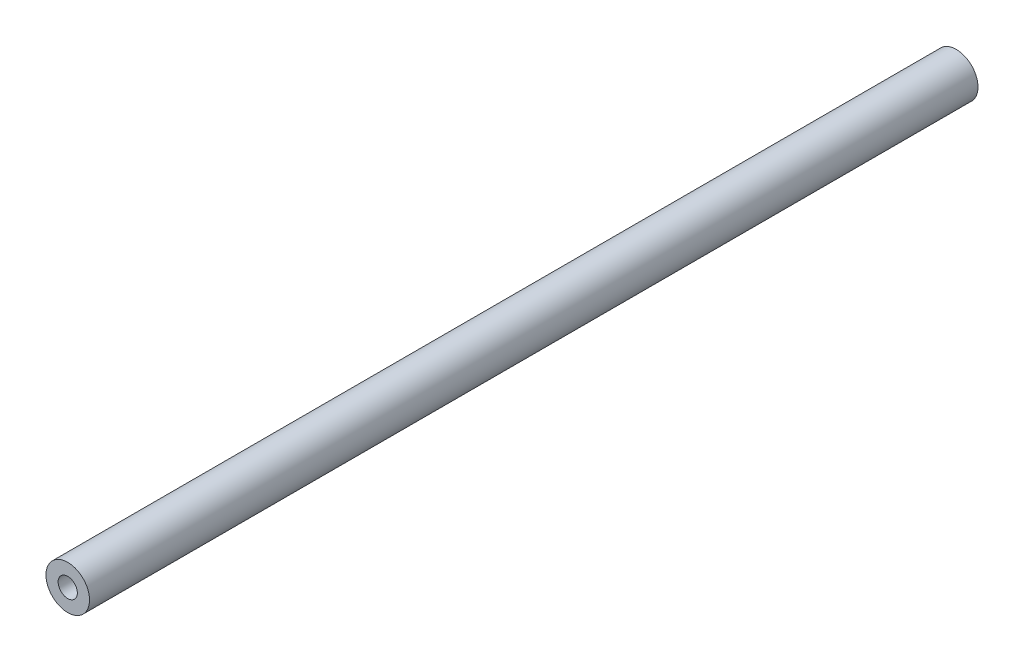
ISO-10303-21;
HEADER;
FILE_DESCRIPTION(('STEP AP214'),'2;1');
FILE_NAME('part.step','',(''),(''),'','','');
FILE_SCHEMA(('AUTOMOTIVE_DESIGN { 1 0 10303 214 1 1 1 1 }'));
ENDSEC;
DATA;
#1=APPLICATION_CONTEXT('core data for automotive mechanical design processes');
#2=APPLICATION_PROTOCOL_DEFINITION('international standard','automotive_design',2000,#1);
#3=PRODUCT_CONTEXT('',#1,'mechanical');
#4=PRODUCT('Part','Part','',(#3));
#5=PRODUCT_RELATED_PRODUCT_CATEGORY('part','',(#4));
#6=PRODUCT_DEFINITION_FORMATION('','',#4);
#7=PRODUCT_DEFINITION_CONTEXT('part definition',#1,'design');
#8=PRODUCT_DEFINITION('design','',#6,#7);
#9=PRODUCT_DEFINITION_SHAPE('','',#8);
#10=(LENGTH_UNIT() NAMED_UNIT(*) SI_UNIT(.MILLI.,.METRE.));
#11=(NAMED_UNIT(*) PLANE_ANGLE_UNIT() SI_UNIT($,.RADIAN.));
#12=(NAMED_UNIT(*) SI_UNIT($,.STERADIAN.) SOLID_ANGLE_UNIT());
#13=UNCERTAINTY_MEASURE_WITH_UNIT(LENGTH_MEASURE(1.E-05),#10,'distance_accuracy_value','');
#14=(GEOMETRIC_REPRESENTATION_CONTEXT(3) GLOBAL_UNCERTAINTY_ASSIGNED_CONTEXT((#13)) GLOBAL_UNIT_ASSIGNED_CONTEXT((#10,
#11,#12)) REPRESENTATION_CONTEXT('',''));
#15=CARTESIAN_POINT('',(0.,0.,0.));
#16=DIRECTION('',(0.,0.,1.));
#17=DIRECTION('',(1.,0.,0.));
#18=AXIS2_PLACEMENT_3D('',#15,#16,#17);
#19=CARTESIAN_POINT('',(0.,0.,80.9625));
#20=DIRECTION('',(0.,0.,-1.));
#21=DIRECTION('',(-1.,0.,0.));
#22=AXIS2_PLACEMENT_3D('',#19,#20,#21);
#23=CYLINDRICAL_SURFACE('',#22,3.96875);
#24=CARTESIAN_POINT('',(0.,0.,80.9625));
#25=DIRECTION('',(0.,0.,1.));
#26=DIRECTION('',(1.,0.,0.));
#27=AXIS2_PLACEMENT_3D('',#24,#25,#26);
#28=CIRCLE('',#27,3.96875);
#29=CARTESIAN_POINT('',(3.96875,0.,80.9625));
#30=VERTEX_POINT('',#29);
#31=EDGE_CURVE('E11',#30,#30,#28,.T.);
#32=ORIENTED_EDGE('',*,*,#31,.F.);
#33=EDGE_LOOP('',(#32));
#34=FACE_BOUND('',#33,.T.);
#35=CARTESIAN_POINT('',(0.,0.,-80.9625));
#36=DIRECTION('',(0.,0.,1.));
#37=DIRECTION('',(1.,0.,0.));
#38=AXIS2_PLACEMENT_3D('',#35,#36,#37);
#39=CIRCLE('',#38,3.96875);
#40=CARTESIAN_POINT('',(3.96875,0.,-80.9625));
#41=VERTEX_POINT('',#40);
#42=EDGE_CURVE('E37',#41,#41,#39,.T.);
#43=ORIENTED_EDGE('',*,*,#42,.T.);
#44=EDGE_LOOP('',(#43));
#45=FACE_BOUND('',#44,.T.);
#46=ADVANCED_FACE('F34',(#34,#45),#23,.T.);
#47=CARTESIAN_POINT('',(0.,0.,80.9625));
#48=DIRECTION('',(0.,0.,1.));
#49=DIRECTION('',(1.,0.,0.));
#50=AXIS2_PLACEMENT_3D('',#47,#48,#49);
#51=PLANE('',#50);
#52=CARTESIAN_POINT('',(0.,0.,80.9625));
#53=DIRECTION('',(0.,0.,1.));
#54=DIRECTION('',(1.,0.,0.));
#55=AXIS2_PLACEMENT_3D('',#52,#53,#54);
#56=CIRCLE('',#55,1.7526);
#57=CARTESIAN_POINT('',(1.7526,0.,80.9625));
#58=VERTEX_POINT('',#57);
#59=EDGE_CURVE('E191',#58,#58,#56,.T.);
#60=ORIENTED_EDGE('',*,*,#59,.F.);
#61=EDGE_LOOP('',(#60));
#62=FACE_BOUND('',#61,.T.);
#63=ORIENTED_EDGE('',*,*,#31,.T.);
#64=EDGE_LOOP('',(#63));
#65=FACE_BOUND('',#64,.T.);
#66=ADVANCED_FACE('F84',(#62,#65),#51,.T.);
#67=CARTESIAN_POINT('',(0.,0.,-80.9625));
#68=DIRECTION('',(0.,0.,1.));
#69=DIRECTION('',(1.,0.,0.));
#70=AXIS2_PLACEMENT_3D('',#67,#68,#69);
#71=PLANE('',#70);
#72=CARTESIAN_POINT('',(0.,0.,-80.9625));
#73=DIRECTION('',(0.,0.,-1.));
#74=DIRECTION('',(-1.,0.,0.));
#75=AXIS2_PLACEMENT_3D('',#72,#73,#74);
#76=CIRCLE('',#75,1.7526);
#77=CARTESIAN_POINT('',(-1.7526,0.,-80.9625));
#78=VERTEX_POINT('',#77);
#79=EDGE_CURVE('E57',#78,#78,#76,.T.);
#80=ORIENTED_EDGE('',*,*,#79,.F.);
#81=EDGE_LOOP('',(#80));
#82=FACE_BOUND('',#81,.T.);
#83=ORIENTED_EDGE('',*,*,#42,.F.);
#84=EDGE_LOOP('',(#83));
#85=FACE_BOUND('',#84,.T.);
#86=ADVANCED_FACE('F81',(#82,#85),#71,.F.);
#87=CARTESIAN_POINT('',(0.,0.,-71.5645));
#88=DIRECTION('',(0.,0.,-1.));
#89=DIRECTION('',(-1.,0.,0.));
#90=AXIS2_PLACEMENT_3D('',#87,#88,#89);
#91=CONICAL_SURFACE('',#90,1.35255,1.02974425867665);
#92=CARTESIAN_POINT('',(0.,0.,-70.7518059697343));
#93=VERTEX_POINT('',#92);
#94=VERTEX_LOOP('',#93);
#95=FACE_BOUND('',#94,.T.);
#96=CARTESIAN_POINT('',(0.,0.,-71.5645));
#97=DIRECTION('',(0.,0.,-1.));
#98=DIRECTION('',(-1.,0.,0.));
#99=AXIS2_PLACEMENT_3D('',#96,#97,#98);
#100=CIRCLE('',#99,1.35255);
#101=CARTESIAN_POINT('',(-1.35255,0.,-71.5645));
#102=VERTEX_POINT('',#101);
#103=EDGE_CURVE('E73',#102,#102,#100,.T.);
#104=ORIENTED_EDGE('',*,*,#103,.T.);
#105=EDGE_LOOP('',(#104));
#106=FACE_BOUND('',#105,.T.);
#107=ADVANCED_FACE('F83',(#95,#106),#91,.F.);
#108=CARTESIAN_POINT('',(0.,0.,-80.9625));
#109=DIRECTION('',(0.,0.,-1.));
#110=DIRECTION('',(-1.,0.,0.));
#111=AXIS2_PLACEMENT_3D('',#108,#109,#110);
#112=CYLINDRICAL_SURFACE('',#111,1.35255);
#113=ORIENTED_EDGE('',*,*,#103,.F.);
#114=EDGE_LOOP('',(#113));
#115=FACE_BOUND('',#114,.T.);
#116=CARTESIAN_POINT('',(0.,0.,-73.8505));
#117=DIRECTION('',(0.,0.,-1.));
#118=DIRECTION('',(-1.,0.,0.));
#119=AXIS2_PLACEMENT_3D('',#116,#117,#118);
#120=CIRCLE('',#119,1.35255);
#121=CARTESIAN_POINT('',(-1.35255,0.,-73.8505));
#122=VERTEX_POINT('',#121);
#123=EDGE_CURVE('E70',#122,#122,#120,.T.);
#124=ORIENTED_EDGE('',*,*,#123,.T.);
#125=EDGE_LOOP('',(#124));
#126=FACE_BOUND('',#125,.T.);
#127=ADVANCED_FACE('F90',(#115,#126),#112,.F.);
#128=CARTESIAN_POINT('',(1.35255,0.,-73.8505));
#129=DIRECTION('',(0.,0.,1.));
#130=DIRECTION('',(1.,0.,0.));
#131=AXIS2_PLACEMENT_3D('',#128,#129,#130);
#132=PLANE('',#131);
#133=ORIENTED_EDGE('',*,*,#123,.F.);
#134=EDGE_LOOP('',(#133));
#135=FACE_BOUND('',#134,.T.);
#136=CARTESIAN_POINT('',(0.,0.,-73.8505));
#137=DIRECTION('',(0.,0.,-1.));
#138=DIRECTION('',(-1.,0.,0.));
#139=AXIS2_PLACEMENT_3D('',#136,#137,#138);
#140=CIRCLE('',#139,1.7526);
#141=CARTESIAN_POINT('',(-1.7526,0.,-73.8505));
#142=VERTEX_POINT('',#141);
#143=EDGE_CURVE('E61',#142,#142,#140,.T.);
#144=ORIENTED_EDGE('',*,*,#143,.T.);
#145=EDGE_LOOP('',(#144));
#146=FACE_BOUND('',#145,.T.);
#147=ADVANCED_FACE('F153',(#135,#146),#132,.F.);
#148=CARTESIAN_POINT('',(0.,0.,-80.9625));
#149=DIRECTION('',(0.,0.,-1.));
#150=DIRECTION('',(-1.,0.,0.));
#151=AXIS2_PLACEMENT_3D('',#148,#149,#150);
#152=CYLINDRICAL_SURFACE('',#151,1.7526);
#153=ORIENTED_EDGE('',*,*,#143,.F.);
#154=EDGE_LOOP('',(#153));
#155=FACE_BOUND('',#154,.T.);
#156=ORIENTED_EDGE('',*,*,#79,.T.);
#157=EDGE_LOOP('',(#156));
#158=FACE_BOUND('',#157,.T.);
#159=ADVANCED_FACE('F51',(#155,#158),#152,.F.);
#160=CARTESIAN_POINT('',(0.,0.,71.5645));
#161=DIRECTION('',(0.,0.,1.));
#162=DIRECTION('',(1.,0.,0.));
#163=AXIS2_PLACEMENT_3D('',#160,#161,#162);
#164=CONICAL_SURFACE('',#163,1.35255,1.02974425867665);
#165=CARTESIAN_POINT('',(0.,0.,70.7518059697343));
#166=VERTEX_POINT('',#165);
#167=VERTEX_LOOP('',#166);
#168=FACE_BOUND('',#167,.T.);
#169=CARTESIAN_POINT('',(0.,0.,71.5645));
#170=DIRECTION('',(0.,0.,1.));
#171=DIRECTION('',(1.,0.,0.));
#172=AXIS2_PLACEMENT_3D('',#169,#170,#171);
#173=CIRCLE('',#172,1.35255);
#174=CARTESIAN_POINT('',(1.35255,0.,71.5645));
#175=VERTEX_POINT('',#174);
#176=EDGE_CURVE('E55',#175,#175,#173,.T.);
#177=ORIENTED_EDGE('',*,*,#176,.T.);
#178=EDGE_LOOP('',(#177));
#179=FACE_BOUND('',#178,.T.);
#180=ADVANCED_FACE('F47',(#168,#179),#164,.F.);
#181=CARTESIAN_POINT('',(0.,0.,80.9625));
#182=DIRECTION('',(0.,0.,1.));
#183=DIRECTION('',(1.,0.,0.));
#184=AXIS2_PLACEMENT_3D('',#181,#182,#183);
#185=CYLINDRICAL_SURFACE('',#184,1.35255);
#186=ORIENTED_EDGE('',*,*,#176,.F.);
#187=EDGE_LOOP('',(#186));
#188=FACE_BOUND('',#187,.T.);
#189=CARTESIAN_POINT('',(0.,0.,73.8505));
#190=DIRECTION('',(0.,0.,1.));
#191=DIRECTION('',(1.,0.,0.));
#192=AXIS2_PLACEMENT_3D('',#189,#190,#191);
#193=CIRCLE('',#192,1.35255);
#194=CARTESIAN_POINT('',(1.35255,0.,73.8505));
#195=VERTEX_POINT('',#194);
#196=EDGE_CURVE('E58',#195,#195,#193,.T.);
#197=ORIENTED_EDGE('',*,*,#196,.T.);
#198=EDGE_LOOP('',(#197));
#199=FACE_BOUND('',#198,.T.);
#200=ADVANCED_FACE('F50',(#188,#199),#185,.F.);
#201=CARTESIAN_POINT('',(1.35255,0.,73.8505));
#202=DIRECTION('',(0.,0.,-1.));
#203=DIRECTION('',(-1.,0.,0.));
#204=AXIS2_PLACEMENT_3D('',#201,#202,#203);
#205=PLANE('',#204);
#206=ORIENTED_EDGE('',*,*,#196,.F.);
#207=EDGE_LOOP('',(#206));
#208=FACE_BOUND('',#207,.T.);
#209=CARTESIAN_POINT('',(0.,0.,73.8505));
#210=DIRECTION('',(0.,0.,1.));
#211=DIRECTION('',(1.,0.,0.));
#212=AXIS2_PLACEMENT_3D('',#209,#210,#211);
#213=CIRCLE('',#212,1.7526);
#214=CARTESIAN_POINT('',(1.7526,0.,73.8505));
#215=VERTEX_POINT('',#214);
#216=EDGE_CURVE('E64',#215,#215,#213,.T.);
#217=ORIENTED_EDGE('',*,*,#216,.T.);
#218=EDGE_LOOP('',(#217));
#219=FACE_BOUND('',#218,.T.);
#220=ADVANCED_FACE('F126',(#208,#219),#205,.F.);
#221=CARTESIAN_POINT('',(0.,0.,80.9625));
#222=DIRECTION('',(0.,0.,1.));
#223=DIRECTION('',(1.,0.,0.));
#224=AXIS2_PLACEMENT_3D('',#221,#222,#223);
#225=CYLINDRICAL_SURFACE('',#224,1.7526);
#226=ORIENTED_EDGE('',*,*,#216,.F.);
#227=EDGE_LOOP('',(#226));
#228=FACE_BOUND('',#227,.T.);
#229=ORIENTED_EDGE('',*,*,#59,.T.);
#230=EDGE_LOOP('',(#229));
#231=FACE_BOUND('',#230,.T.);
#232=ADVANCED_FACE('F135',(#228,#231),#225,.F.);
#233=CLOSED_SHELL('',(#46,#66,#86,#107,#127,#147,#159,#180,#200,#220,#232));
#234=MANIFOLD_SOLID_BREP('B2',#233);
#235=ADVANCED_BREP_SHAPE_REPRESENTATION('',(#18,#234),#14);
#236=SHAPE_DEFINITION_REPRESENTATION(#9,#235);
ENDSEC;
END-ISO-10303-21;
